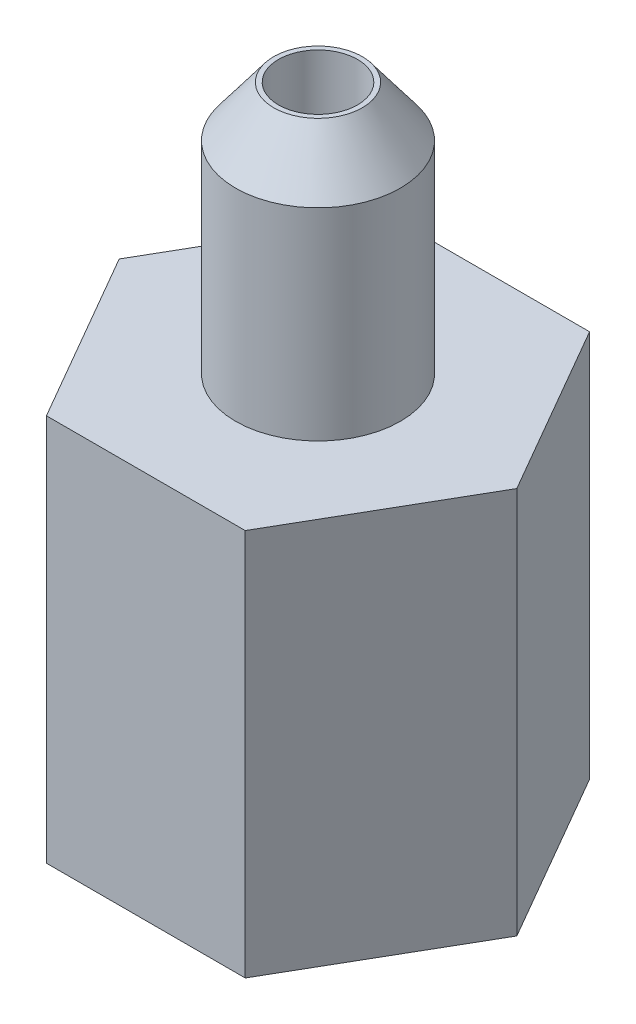
ISO-10303-21;
HEADER;
FILE_DESCRIPTION(('STEP AP214'),'2;1');
FILE_NAME('part.step','',(''),(''),'','','');
FILE_SCHEMA(('AUTOMOTIVE_DESIGN { 1 0 10303 214 1 1 1 1 }'));
ENDSEC;
DATA;
#1=APPLICATION_CONTEXT('core data for automotive mechanical design processes');
#2=APPLICATION_PROTOCOL_DEFINITION('international standard','automotive_design',2000,#1);
#3=PRODUCT_CONTEXT('',#1,'mechanical');
#4=PRODUCT('Part','Part','',(#3));
#5=PRODUCT_RELATED_PRODUCT_CATEGORY('part','',(#4));
#6=PRODUCT_DEFINITION_FORMATION('','',#4);
#7=PRODUCT_DEFINITION_CONTEXT('part definition',#1,'design');
#8=PRODUCT_DEFINITION('design','',#6,#7);
#9=PRODUCT_DEFINITION_SHAPE('','',#8);
#10=(LENGTH_UNIT() NAMED_UNIT(*) SI_UNIT(.MILLI.,.METRE.));
#11=(NAMED_UNIT(*) PLANE_ANGLE_UNIT() SI_UNIT($,.RADIAN.));
#12=(NAMED_UNIT(*) SI_UNIT($,.STERADIAN.) SOLID_ANGLE_UNIT());
#13=UNCERTAINTY_MEASURE_WITH_UNIT(LENGTH_MEASURE(1.E-05),#10,'distance_accuracy_value','');
#14=(GEOMETRIC_REPRESENTATION_CONTEXT(3) GLOBAL_UNCERTAINTY_ASSIGNED_CONTEXT((#13)) GLOBAL_UNIT_ASSIGNED_CONTEXT((#10,
#11,#12)) REPRESENTATION_CONTEXT('',''));
#15=CARTESIAN_POINT('',(0.,0.,0.));
#16=DIRECTION('',(0.,0.,1.));
#17=DIRECTION('',(1.,0.,0.));
#18=AXIS2_PLACEMENT_3D('',#15,#16,#17);
#19=CARTESIAN_POINT('',(0.,35.4076,0.));
#20=DIRECTION('',(0.,-1.,0.));
#21=DIRECTION('',(0.,0.,-1.));
#22=AXIS2_PLACEMENT_3D('',#19,#20,#21);
#23=CYLINDRICAL_SURFACE('',#22,4.5593);
#24=CARTESIAN_POINT('',(0.,21.4376,0.));
#25=DIRECTION('',(0.,1.,0.));
#26=DIRECTION('',(0.,0.,1.));
#27=AXIS2_PLACEMENT_3D('',#24,#25,#26);
#28=CIRCLE('',#27,4.5593);
#29=CARTESIAN_POINT('',(0.,21.4376,4.5593));
#30=VERTEX_POINT('',#29);
#31=EDGE_CURVE('E12',#30,#30,#28,.T.);
#32=ORIENTED_EDGE('',*,*,#31,.T.);
#33=EDGE_LOOP('',(#32));
#34=FACE_BOUND('',#33,.T.);
#35=CARTESIAN_POINT('',(0.,32.6099241070599,0.));
#36=DIRECTION('',(0.,-1.,0.));
#37=DIRECTION('',(0.,0.,-1.));
#38=AXIS2_PLACEMENT_3D('',#35,#36,#37);
#39=CIRCLE('',#38,4.5593);
#40=CARTESIAN_POINT('',(0.,32.6099241070599,-4.5593));
#41=VERTEX_POINT('',#40);
#42=EDGE_CURVE('E128',#41,#41,#39,.F.);
#43=ORIENTED_EDGE('',*,*,#42,.F.);
#44=EDGE_LOOP('',(#43));
#45=FACE_BOUND('',#44,.T.);
#46=ADVANCED_FACE('F36',(#34,#45),#23,.T.);
#47=CARTESIAN_POINT('',(-5.4992613140313,21.4376,-9.52499999999995));
#48=DIRECTION('',(0.866025403784441,0.,0.499999999999995));
#49=DIRECTION('',(0.499999999999995,0.,-0.866025403784442));
#50=AXIS2_PLACEMENT_3D('',#47,#48,#49);
#51=PLANE('',#50);
#52=DIRECTION('',(-0.499999999999995,0.,0.866025403784441));
#53=VECTOR('',#52,1.);
#54=CARTESIAN_POINT('',(-5.4992613140313,0.,-9.52499999999995));
#55=LINE('',#54,#53);
#56=CARTESIAN_POINT('',(-5.4992613140313,0.,-9.52499999999995));
#57=VERTEX_POINT('',#56);
#58=CARTESIAN_POINT('',(-10.9985226280624,0.,0.));
#59=VERTEX_POINT('',#58);
#60=EDGE_CURVE('E124',#57,#59,#55,.T.);
#61=ORIENTED_EDGE('',*,*,#60,.T.);
#62=DIRECTION('',(0.,-1.,0.));
#63=VECTOR('',#62,1.);
#64=CARTESIAN_POINT('',(-10.9985226280624,21.4376,0.));
#65=LINE('',#64,#63);
#66=CARTESIAN_POINT('',(-10.9985226280624,21.4376,0.));
#67=VERTEX_POINT('',#66);
#68=EDGE_CURVE('E46',#67,#59,#65,.T.);
#69=ORIENTED_EDGE('',*,*,#68,.F.);
#70=DIRECTION('',(-0.499999999999995,0.,0.866025403784441));
#71=VECTOR('',#70,1.);
#72=CARTESIAN_POINT('',(-5.4992613140313,21.4376,-9.52499999999995));
#73=LINE('',#72,#71);
#74=CARTESIAN_POINT('',(-5.4992613140313,21.4376,-9.52499999999995));
#75=VERTEX_POINT('',#74);
#76=EDGE_CURVE('E135',#75,#67,#73,.T.);
#77=ORIENTED_EDGE('',*,*,#76,.F.);
#78=DIRECTION('',(0.,-1.,0.));
#79=VECTOR('',#78,1.);
#80=CARTESIAN_POINT('',(-5.4992613140313,21.4376,-9.52499999999995));
#81=LINE('',#80,#79);
#82=EDGE_CURVE('E120',#75,#57,#81,.T.);
#83=ORIENTED_EDGE('',*,*,#82,.T.);
#84=EDGE_LOOP('',(#61,#69,#77,#83));
#85=FACE_BOUND('',#84,.T.);
#86=ADVANCED_FACE('F38',(#85),#51,.F.);
#87=CARTESIAN_POINT('',(-10.9985226280624,21.4376,0.));
#88=DIRECTION('',(0.866025403784438,0.,-0.500000000000001));
#89=DIRECTION('',(-0.500000000000001,0.,-0.866025403784438));
#90=AXIS2_PLACEMENT_3D('',#87,#88,#89);
#91=PLANE('',#90);
#92=DIRECTION('',(0.500000000000001,0.,0.866025403784438));
#93=VECTOR('',#92,1.);
#94=CARTESIAN_POINT('',(-10.9985226280624,0.,0.));
#95=LINE('',#94,#93);
#96=CARTESIAN_POINT('',(-5.49926131403117,0.,9.52500000000002));
#97=VERTEX_POINT('',#96);
#98=EDGE_CURVE('E127',#59,#97,#95,.T.);
#99=ORIENTED_EDGE('',*,*,#98,.T.);
#100=DIRECTION('',(0.,-1.,0.));
#101=VECTOR('',#100,1.);
#102=CARTESIAN_POINT('',(-5.49926131403117,21.4376,9.52500000000002));
#103=LINE('',#102,#101);
#104=CARTESIAN_POINT('',(-5.49926131403117,21.4376,9.52500000000002));
#105=VERTEX_POINT('',#104);
#106=EDGE_CURVE('E139',#105,#97,#103,.T.);
#107=ORIENTED_EDGE('',*,*,#106,.F.);
#108=DIRECTION('',(0.500000000000001,0.,0.866025403784438));
#109=VECTOR('',#108,1.);
#110=CARTESIAN_POINT('',(-10.9985226280624,21.4376,0.));
#111=LINE('',#110,#109);
#112=EDGE_CURVE('E93',#67,#105,#111,.T.);
#113=ORIENTED_EDGE('',*,*,#112,.F.);
#114=ORIENTED_EDGE('',*,*,#68,.T.);
#115=EDGE_LOOP('',(#99,#107,#113,#114));
#116=FACE_BOUND('',#115,.T.);
#117=ADVANCED_FACE('F142',(#116),#91,.F.);
#118=CARTESIAN_POINT('',(-5.49926131403117,21.4376,9.52500000000002));
#119=DIRECTION('',(0.,0.,-1.));
#120=DIRECTION('',(-1.,0.,0.));
#121=AXIS2_PLACEMENT_3D('',#118,#119,#120);
#122=PLANE('',#121);
#123=DIRECTION('',(1.,0.,0.));
#124=VECTOR('',#123,1.);
#125=CARTESIAN_POINT('',(-5.49926131403117,0.,9.52500000000002));
#126=LINE('',#125,#124);
#127=CARTESIAN_POINT('',(5.49926131403123,0.,9.52499999999998));
#128=VERTEX_POINT('',#127);
#129=EDGE_CURVE('E130',#97,#128,#126,.T.);
#130=ORIENTED_EDGE('',*,*,#129,.T.);
#131=DIRECTION('',(0.,-1.,0.));
#132=VECTOR('',#131,1.);
#133=CARTESIAN_POINT('',(5.49926131403123,21.4376,9.52499999999998));
#134=LINE('',#133,#132);
#135=CARTESIAN_POINT('',(5.49926131403123,21.4376,9.52499999999998));
#136=VERTEX_POINT('',#135);
#137=EDGE_CURVE('E115',#136,#128,#134,.T.);
#138=ORIENTED_EDGE('',*,*,#137,.F.);
#139=DIRECTION('',(1.,0.,0.));
#140=VECTOR('',#139,1.);
#141=CARTESIAN_POINT('',(-5.49926131403117,21.4376,9.52500000000002));
#142=LINE('',#141,#140);
#143=EDGE_CURVE('E106',#105,#136,#142,.T.);
#144=ORIENTED_EDGE('',*,*,#143,.F.);
#145=ORIENTED_EDGE('',*,*,#106,.T.);
#146=EDGE_LOOP('',(#130,#138,#144,#145));
#147=FACE_BOUND('',#146,.T.);
#148=ADVANCED_FACE('F150',(#147),#122,.F.);
#149=CARTESIAN_POINT('',(5.49926131403123,21.4376,9.52499999999998));
#150=DIRECTION('',(-0.866025403784442,0.,-0.499999999999995));
#151=DIRECTION('',(-0.499999999999995,0.,0.866025403784442));
#152=AXIS2_PLACEMENT_3D('',#149,#150,#151);
#153=PLANE('',#152);
#154=DIRECTION('',(0.499999999999995,0.,-0.866025403784442));
#155=VECTOR('',#154,1.);
#156=CARTESIAN_POINT('',(5.49926131403123,0.,9.52499999999998));
#157=LINE('',#156,#155);
#158=CARTESIAN_POINT('',(10.9985226280624,0.,0.));
#159=VERTEX_POINT('',#158);
#160=EDGE_CURVE('E114',#128,#159,#157,.T.);
#161=ORIENTED_EDGE('',*,*,#160,.T.);
#162=DIRECTION('',(0.,-1.,0.));
#163=VECTOR('',#162,1.);
#164=CARTESIAN_POINT('',(10.9985226280624,21.4376,0.));
#165=LINE('',#164,#163);
#166=CARTESIAN_POINT('',(10.9985226280624,21.4376,0.));
#167=VERTEX_POINT('',#166);
#168=EDGE_CURVE('E111',#167,#159,#165,.T.);
#169=ORIENTED_EDGE('',*,*,#168,.F.);
#170=DIRECTION('',(0.499999999999995,0.,-0.866025403784442));
#171=VECTOR('',#170,1.);
#172=CARTESIAN_POINT('',(5.49926131403123,21.4376,9.52499999999998));
#173=LINE('',#172,#171);
#174=EDGE_CURVE('E100',#136,#167,#173,.T.);
#175=ORIENTED_EDGE('',*,*,#174,.F.);
#176=ORIENTED_EDGE('',*,*,#137,.T.);
#177=EDGE_LOOP('',(#161,#169,#175,#176));
#178=FACE_BOUND('',#177,.T.);
#179=ADVANCED_FACE('F112',(#178),#153,.F.);
#180=CARTESIAN_POINT('',(10.9985226280624,21.4376,0.));
#181=DIRECTION('',(-0.866025403784435,0.,0.500000000000007));
#182=DIRECTION('',(0.500000000000007,0.,0.866025403784435));
#183=AXIS2_PLACEMENT_3D('',#180,#181,#182);
#184=PLANE('',#183);
#185=DIRECTION('',(-0.500000000000007,0.,-0.866025403784435));
#186=VECTOR('',#185,1.);
#187=CARTESIAN_POINT('',(10.9985226280624,0.,0.));
#188=LINE('',#187,#186);
#189=CARTESIAN_POINT('',(5.4992613140311,0.,-9.52500000000006));
#190=VERTEX_POINT('',#189);
#191=EDGE_CURVE('E78',#159,#190,#188,.T.);
#192=ORIENTED_EDGE('',*,*,#191,.T.);
#193=DIRECTION('',(0.,-1.,0.));
#194=VECTOR('',#193,1.);
#195=CARTESIAN_POINT('',(5.4992613140311,21.4376,-9.52500000000006));
#196=LINE('',#195,#194);
#197=CARTESIAN_POINT('',(5.4992613140311,21.4376,-9.52500000000006));
#198=VERTEX_POINT('',#197);
#199=EDGE_CURVE('E116',#198,#190,#196,.T.);
#200=ORIENTED_EDGE('',*,*,#199,.F.);
#201=DIRECTION('',(-0.500000000000007,0.,-0.866025403784435));
#202=VECTOR('',#201,1.);
#203=CARTESIAN_POINT('',(10.9985226280624,21.4376,0.));
#204=LINE('',#203,#202);
#205=EDGE_CURVE('E104',#167,#198,#204,.T.);
#206=ORIENTED_EDGE('',*,*,#205,.F.);
#207=ORIENTED_EDGE('',*,*,#168,.T.);
#208=EDGE_LOOP('',(#192,#200,#206,#207));
#209=FACE_BOUND('',#208,.T.);
#210=ADVANCED_FACE('F118',(#209),#184,.F.);
#211=CARTESIAN_POINT('',(5.4992613140311,21.4376,-9.52500000000006));
#212=DIRECTION('',(0.,0.,1.));
#213=DIRECTION('',(1.,0.,0.));
#214=AXIS2_PLACEMENT_3D('',#211,#212,#213);
#215=PLANE('',#214);
#216=DIRECTION('',(-1.,0.,0.));
#217=VECTOR('',#216,1.);
#218=CARTESIAN_POINT('',(5.4992613140311,0.,-9.52500000000006));
#219=LINE('',#218,#217);
#220=EDGE_CURVE('E84',#190,#57,#219,.T.);
#221=ORIENTED_EDGE('',*,*,#220,.T.);
#222=ORIENTED_EDGE('',*,*,#82,.F.);
#223=DIRECTION('',(-1.,0.,0.));
#224=VECTOR('',#223,1.);
#225=CARTESIAN_POINT('',(5.4992613140311,21.4376,-9.52500000000006));
#226=LINE('',#225,#224);
#227=EDGE_CURVE('E55',#198,#75,#226,.T.);
#228=ORIENTED_EDGE('',*,*,#227,.F.);
#229=ORIENTED_EDGE('',*,*,#199,.T.);
#230=EDGE_LOOP('',(#221,#222,#228,#229));
#231=FACE_BOUND('',#230,.T.);
#232=ADVANCED_FACE('F182',(#231),#215,.F.);
#233=CARTESIAN_POINT('',(0.,21.4376,0.));
#234=DIRECTION('',(0.,1.,0.));
#235=DIRECTION('',(0.,0.,1.));
#236=AXIS2_PLACEMENT_3D('',#233,#234,#235);
#237=PLANE('',#236);
#238=ORIENTED_EDGE('',*,*,#31,.F.);
#239=EDGE_LOOP('',(#238));
#240=FACE_BOUND('',#239,.T.);
#241=ORIENTED_EDGE('',*,*,#76,.T.);
#242=ORIENTED_EDGE('',*,*,#112,.T.);
#243=ORIENTED_EDGE('',*,*,#143,.T.);
#244=ORIENTED_EDGE('',*,*,#174,.T.);
#245=ORIENTED_EDGE('',*,*,#205,.T.);
#246=ORIENTED_EDGE('',*,*,#227,.T.);
#247=EDGE_LOOP('',(#241,#242,#243,#244,#245,#246));
#248=FACE_BOUND('',#247,.T.);
#249=ADVANCED_FACE('F102',(#240,#248),#237,.T.);
#250=CARTESIAN_POINT('',(0.,0.,0.));
#251=DIRECTION('',(0.,1.,0.));
#252=DIRECTION('',(0.,0.,1.));
#253=AXIS2_PLACEMENT_3D('',#250,#251,#252);
#254=PLANE('',#253);
#255=CARTESIAN_POINT('',(0.,0.,0.));
#256=DIRECTION('',(0.,-1.,0.));
#257=DIRECTION('',(0.,0.,-1.));
#258=AXIS2_PLACEMENT_3D('',#255,#256,#257);
#259=CIRCLE('',#258,5.5626);
#260=CARTESIAN_POINT('',(0.,0.,-5.5626));
#261=VERTEX_POINT('',#260);
#262=EDGE_CURVE('E165',#261,#261,#259,.T.);
#263=ORIENTED_EDGE('',*,*,#262,.F.);
#264=EDGE_LOOP('',(#263));
#265=FACE_BOUND('',#264,.T.);
#266=ORIENTED_EDGE('',*,*,#60,.F.);
#267=ORIENTED_EDGE('',*,*,#220,.F.);
#268=ORIENTED_EDGE('',*,*,#191,.F.);
#269=ORIENTED_EDGE('',*,*,#160,.F.);
#270=ORIENTED_EDGE('',*,*,#129,.F.);
#271=ORIENTED_EDGE('',*,*,#98,.F.);
#272=EDGE_LOOP('',(#266,#267,#268,#269,#270,#271));
#273=FACE_BOUND('',#272,.T.);
#274=ADVANCED_FACE('F147',(#265,#273),#254,.F.);
#275=CARTESIAN_POINT('',(0.,35.4076,0.));
#276=DIRECTION('',(0.,-1.,0.));
#277=DIRECTION('',(0.,0.,1.));
#278=AXIS2_PLACEMENT_3D('',#275,#276,#277);
#279=CONICAL_SURFACE('',#278,2.4511,0.645771823237903);
#280=CARTESIAN_POINT('',(0.,35.4076,0.));
#281=DIRECTION('',(0.,1.,0.));
#282=DIRECTION('',(0.,0.,1.));
#283=AXIS2_PLACEMENT_3D('',#280,#281,#282);
#284=CIRCLE('',#283,2.4511);
#285=CARTESIAN_POINT('',(0.,35.4076,2.4511));
#286=VERTEX_POINT('',#285);
#287=EDGE_CURVE('E156',#286,#286,#284,.T.);
#288=ORIENTED_EDGE('',*,*,#287,.F.);
#289=EDGE_LOOP('',(#288));
#290=FACE_BOUND('',#289,.T.);
#291=ORIENTED_EDGE('',*,*,#42,.T.);
#292=EDGE_LOOP('',(#291));
#293=FACE_BOUND('',#292,.T.);
#294=ADVANCED_FACE('F173',(#290,#293),#279,.T.);
#295=CARTESIAN_POINT('',(0.,35.4076,0.));
#296=DIRECTION('',(0.,1.,0.));
#297=DIRECTION('',(0.,0.,1.));
#298=AXIS2_PLACEMENT_3D('',#295,#296,#297);
#299=PLANE('',#298);
#300=CARTESIAN_POINT('',(0.,35.4076,0.));
#301=DIRECTION('',(0.,1.,0.));
#302=DIRECTION('',(0.,0.,1.));
#303=AXIS2_PLACEMENT_3D('',#300,#301,#302);
#304=CIRCLE('',#303,2.1844);
#305=CARTESIAN_POINT('',(0.,35.4076,2.1844));
#306=VERTEX_POINT('',#305);
#307=EDGE_CURVE('E159',#306,#306,#304,.T.);
#308=ORIENTED_EDGE('',*,*,#307,.F.);
#309=EDGE_LOOP('',(#308));
#310=FACE_BOUND('',#309,.T.);
#311=ORIENTED_EDGE('',*,*,#287,.T.);
#312=EDGE_LOOP('',(#311));
#313=FACE_BOUND('',#312,.T.);
#314=ADVANCED_FACE('F179',(#310,#313),#299,.T.);
#315=CARTESIAN_POINT('',(0.,0.,0.));
#316=DIRECTION('',(0.,1.,0.));
#317=DIRECTION('',(0.,0.,1.));
#318=AXIS2_PLACEMENT_3D('',#315,#316,#317);
#319=CYLINDRICAL_SURFACE('',#318,2.1844);
#320=CARTESIAN_POINT('',(0.,15.0876,0.));
#321=DIRECTION('',(0.,1.,0.));
#322=DIRECTION('',(0.,0.,1.));
#323=AXIS2_PLACEMENT_3D('',#320,#321,#322);
#324=CIRCLE('',#323,2.1844);
#325=CARTESIAN_POINT('',(0.,15.0876,2.1844));
#326=VERTEX_POINT('',#325);
#327=EDGE_CURVE('E40',#326,#326,#324,.F.);
#328=ORIENTED_EDGE('',*,*,#327,.T.);
#329=EDGE_LOOP('',(#328));
#330=FACE_BOUND('',#329,.T.);
#331=ORIENTED_EDGE('',*,*,#307,.T.);
#332=EDGE_LOOP('',(#331));
#333=FACE_BOUND('',#332,.T.);
#334=ADVANCED_FACE('F195',(#330,#333),#319,.F.);
#335=CARTESIAN_POINT('',(0.,15.0876,0.));
#336=DIRECTION('',(0.,1.,0.));
#337=DIRECTION('',(0.,0.,1.));
#338=AXIS2_PLACEMENT_3D('',#335,#336,#337);
#339=PLANE('',#338);
#340=CARTESIAN_POINT('',(0.,15.0876,0.));
#341=DIRECTION('',(0.,1.,0.));
#342=DIRECTION('',(0.,0.,1.));
#343=AXIS2_PLACEMENT_3D('',#340,#341,#342);
#344=CIRCLE('',#343,5.5626);
#345=CARTESIAN_POINT('',(0.,15.0876,5.5626));
#346=VERTEX_POINT('',#345);
#347=EDGE_CURVE('E162',#346,#346,#344,.F.);
#348=ORIENTED_EDGE('',*,*,#347,.T.);
#349=EDGE_LOOP('',(#348));
#350=FACE_BOUND('',#349,.T.);
#351=ORIENTED_EDGE('',*,*,#327,.F.);
#352=EDGE_LOOP('',(#351));
#353=FACE_BOUND('',#352,.T.);
#354=ADVANCED_FACE('F200',(#350,#353),#339,.F.);
#355=CARTESIAN_POINT('',(0.,37.1710087241132,0.));
#356=DIRECTION('',(0.,-1.,0.));
#357=DIRECTION('',(0.,0.,-1.));
#358=AXIS2_PLACEMENT_3D('',#355,#356,#357);
#359=CYLINDRICAL_SURFACE('',#358,5.5626);
#360=ORIENTED_EDGE('',*,*,#262,.T.);
#361=EDGE_LOOP('',(#360));
#362=FACE_BOUND('',#361,.T.);
#363=ORIENTED_EDGE('',*,*,#347,.F.);
#364=EDGE_LOOP('',(#363));
#365=FACE_BOUND('',#364,.T.);
#366=ADVANCED_FACE('F169',(#362,#365),#359,.F.);
#367=CLOSED_SHELL('',(#46,#86,#117,#148,#179,#210,#232,#249,#274,#294,#314,#334,#354,#366));
#368=MANIFOLD_SOLID_BREP('B2',#367);
#369=ADVANCED_BREP_SHAPE_REPRESENTATION('',(#18,#368),#14);
#370=SHAPE_DEFINITION_REPRESENTATION(#9,#369);
ENDSEC;
END-ISO-10303-21;
